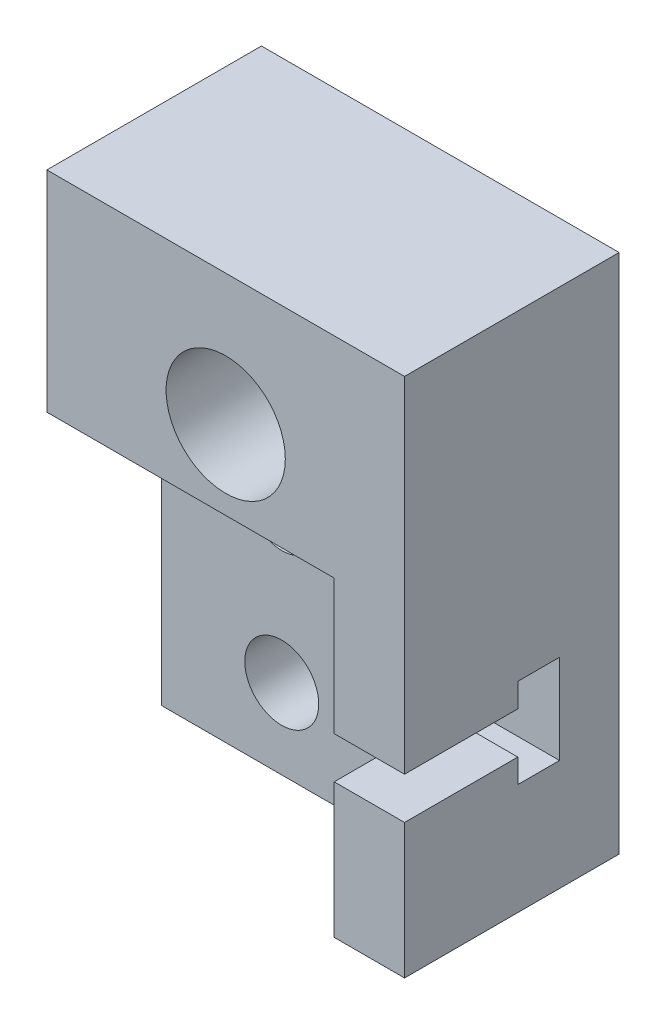
ISO-10303-21;
HEADER;
FILE_DESCRIPTION(('STEP AP214'),'2;1');
FILE_NAME('part.step','',(''),(''),'','','');
FILE_SCHEMA(('AUTOMOTIVE_DESIGN { 1 0 10303 214 1 1 1 1 }'));
ENDSEC;
DATA;
#1=APPLICATION_CONTEXT('core data for automotive mechanical design processes');
#2=APPLICATION_PROTOCOL_DEFINITION('international standard','automotive_design',2000,#1);
#3=PRODUCT_CONTEXT('',#1,'mechanical');
#4=PRODUCT('Part','Part','',(#3));
#5=PRODUCT_RELATED_PRODUCT_CATEGORY('part','',(#4));
#6=PRODUCT_DEFINITION_FORMATION('','',#4);
#7=PRODUCT_DEFINITION_CONTEXT('part definition',#1,'design');
#8=PRODUCT_DEFINITION('design','',#6,#7);
#9=PRODUCT_DEFINITION_SHAPE('','',#8);
#10=(LENGTH_UNIT() NAMED_UNIT(*) SI_UNIT(.MILLI.,.METRE.));
#11=(NAMED_UNIT(*) PLANE_ANGLE_UNIT() SI_UNIT($,.RADIAN.));
#12=(NAMED_UNIT(*) SI_UNIT($,.STERADIAN.) SOLID_ANGLE_UNIT());
#13=UNCERTAINTY_MEASURE_WITH_UNIT(LENGTH_MEASURE(1.E-05),#10,'distance_accuracy_value','');
#14=(GEOMETRIC_REPRESENTATION_CONTEXT(3) GLOBAL_UNCERTAINTY_ASSIGNED_CONTEXT((#13)) GLOBAL_UNIT_ASSIGNED_CONTEXT((#10,
#11,#12)) REPRESENTATION_CONTEXT('',''));
#15=CARTESIAN_POINT('',(0.,0.,0.));
#16=DIRECTION('',(0.,0.,1.));
#17=DIRECTION('',(1.,0.,0.));
#18=AXIS2_PLACEMENT_3D('',#15,#16,#17);
#19=CARTESIAN_POINT('',(12.05,13.05,4.2));
#20=DIRECTION('',(1.,0.,0.));
#21=DIRECTION('',(0.,1.,0.));
#22=AXIS2_PLACEMENT_3D('',#19,#20,#21);
#23=PLANE('',#22);
#24=DIRECTION('',(0.,1.,0.));
#25=VECTOR('',#24,1.);
#26=CARTESIAN_POINT('',(12.05,13.05,4.2));
#27=LINE('',#26,#25);
#28=CARTESIAN_POINT('',(12.05,8.4,4.2));
#29=VERTEX_POINT('',#28);
#30=CARTESIAN_POINT('',(12.05,13.05,4.2));
#31=VERTEX_POINT('',#30);
#32=EDGE_CURVE('E250',#29,#31,#27,.T.);
#33=ORIENTED_EDGE('',*,*,#32,.F.);
#34=DIRECTION('',(0.,0.,1.));
#35=VECTOR('',#34,1.);
#36=CARTESIAN_POINT('',(12.05,8.4,2.5));
#37=LINE('',#36,#35);
#38=CARTESIAN_POINT('',(12.05,8.4,4.25));
#39=VERTEX_POINT('',#38);
#40=EDGE_CURVE('E210',#29,#39,#37,.T.);
#41=ORIENTED_EDGE('',*,*,#40,.T.);
#42=DIRECTION('',(0.,-1.,0.));
#43=VECTOR('',#42,1.);
#44=CARTESIAN_POINT('',(12.05,8.4,4.25));
#45=LINE('',#44,#43);
#46=CARTESIAN_POINT('',(12.05,7.4,4.25));
#47=VERTEX_POINT('',#46);
#48=EDGE_CURVE('E198',#39,#47,#45,.T.);
#49=ORIENTED_EDGE('',*,*,#48,.T.);
#50=DIRECTION('',(0.,0.,1.));
#51=VECTOR('',#50,1.);
#52=CARTESIAN_POINT('',(12.05,7.4,4.25));
#53=LINE('',#52,#51);
#54=CARTESIAN_POINT('',(12.05,7.4,9.));
#55=VERTEX_POINT('',#54);
#56=EDGE_CURVE('E222',#47,#55,#53,.T.);
#57=ORIENTED_EDGE('',*,*,#56,.T.);
#58=DIRECTION('',(0.,1.,0.));
#59=VECTOR('',#58,1.);
#60=CARTESIAN_POINT('',(12.05,13.05,9.));
#61=LINE('',#60,#59);
#62=CARTESIAN_POINT('',(12.05,13.05,9.));
#63=VERTEX_POINT('',#62);
#64=EDGE_CURVE('E235',#55,#63,#61,.T.);
#65=ORIENTED_EDGE('',*,*,#64,.T.);
#66=DIRECTION('',(0.,0.,1.));
#67=VECTOR('',#66,1.);
#68=CARTESIAN_POINT('',(12.05,13.05,4.2));
#69=LINE('',#68,#67);
#70=EDGE_CURVE('E265',#31,#63,#69,.T.);
#71=ORIENTED_EDGE('',*,*,#70,.F.);
#72=EDGE_LOOP('',(#33,#41,#49,#57,#65,#71));
#73=FACE_BOUND('',#72,.T.);
#74=ADVANCED_FACE('F41',(#73),#23,.F.);
#75=CARTESIAN_POINT('',(0.,0.,9.));
#76=DIRECTION('',(0.,0.,-1.));
#77=DIRECTION('',(-1.,0.,0.));
#78=AXIS2_PLACEMENT_3D('',#75,#76,#77);
#79=PLANE('',#78);
#80=CARTESIAN_POINT('',(7.5,16.35,9.));
#81=DIRECTION('',(0.,0.,1.));
#82=DIRECTION('',(1.,0.,0.));
#83=AXIS2_PLACEMENT_3D('',#80,#81,#82);
#84=CIRCLE('',#83,2.5);
#85=CARTESIAN_POINT('',(10.,16.35,9.));
#86=VERTEX_POINT('',#85);
#87=EDGE_CURVE('E193',#86,#86,#84,.T.);
#88=ORIENTED_EDGE('',*,*,#87,.F.);
#89=EDGE_LOOP('',(#88));
#90=FACE_BOUND('',#89,.T.);
#91=ORIENTED_EDGE('',*,*,#64,.F.);
#92=DIRECTION('',(-1.,0.,0.));
#93=VECTOR('',#92,1.);
#94=CARTESIAN_POINT('',(12.05,7.4,9.));
#95=LINE('',#94,#93);
#96=CARTESIAN_POINT('',(15.,7.4,9.));
#97=VERTEX_POINT('',#96);
#98=EDGE_CURVE('E217',#97,#55,#95,.T.);
#99=ORIENTED_EDGE('',*,*,#98,.F.);
#100=DIRECTION('',(0.,1.,0.));
#101=VECTOR('',#100,1.);
#102=CARTESIAN_POINT('',(15.,0.,9.));
#103=LINE('',#102,#101);
#104=CARTESIAN_POINT('',(15.,21.85,9.));
#105=VERTEX_POINT('',#104);
#106=EDGE_CURVE('E275',#97,#105,#103,.T.);
#107=ORIENTED_EDGE('',*,*,#106,.T.);
#108=DIRECTION('',(-1.,0.,0.));
#109=VECTOR('',#108,1.);
#110=CARTESIAN_POINT('',(0.,21.85,9.));
#111=LINE('',#110,#109);
#112=CARTESIAN_POINT('',(0.,21.85,9.));
#113=VERTEX_POINT('',#112);
#114=EDGE_CURVE('E279',#105,#113,#111,.T.);
#115=ORIENTED_EDGE('',*,*,#114,.T.);
#116=DIRECTION('',(0.,-1.,0.));
#117=VECTOR('',#116,1.);
#118=CARTESIAN_POINT('',(0.,0.,9.));
#119=LINE('',#118,#117);
#120=CARTESIAN_POINT('',(0.,13.05,9.));
#121=VERTEX_POINT('',#120);
#122=EDGE_CURVE('E269',#113,#121,#119,.T.);
#123=ORIENTED_EDGE('',*,*,#122,.T.);
#124=DIRECTION('',(-1.,0.,0.));
#125=VECTOR('',#124,1.);
#126=CARTESIAN_POINT('',(0.,13.05,9.));
#127=LINE('',#126,#125);
#128=EDGE_CURVE('E247',#63,#121,#127,.T.);
#129=ORIENTED_EDGE('',*,*,#128,.F.);
#130=EDGE_LOOP('',(#91,#99,#107,#115,#123,#129));
#131=FACE_BOUND('',#130,.T.);
#132=ADVANCED_FACE('F329',(#90,#131),#79,.F.);
#133=CARTESIAN_POINT('',(0.,0.,9.));
#134=DIRECTION('',(1.,0.,0.));
#135=DIRECTION('',(0.,0.,-1.));
#136=AXIS2_PLACEMENT_3D('',#133,#134,#135);
#137=PLANE('',#136);
#138=DIRECTION('',(0.,-1.,0.));
#139=VECTOR('',#138,1.);
#140=CARTESIAN_POINT('',(0.,13.05,4.2));
#141=LINE('',#140,#139);
#142=CARTESIAN_POINT('',(0.,13.05,4.2));
#143=VERTEX_POINT('',#142);
#144=CARTESIAN_POINT('',(0.,0.,4.2));
#145=VERTEX_POINT('',#144);
#146=EDGE_CURVE('E244',#143,#145,#141,.T.);
#147=ORIENTED_EDGE('',*,*,#146,.F.);
#148=DIRECTION('',(0.,0.,1.));
#149=VECTOR('',#148,1.);
#150=CARTESIAN_POINT('',(0.,13.05,4.2));
#151=LINE('',#150,#149);
#152=EDGE_CURVE('E261',#143,#121,#151,.T.);
#153=ORIENTED_EDGE('',*,*,#152,.T.);
#154=ORIENTED_EDGE('',*,*,#122,.F.);
#155=DIRECTION('',(0.,0.,-1.));
#156=VECTOR('',#155,1.);
#157=CARTESIAN_POINT('',(0.,21.85,9.));
#158=LINE('',#157,#156);
#159=CARTESIAN_POINT('',(0.,21.85,0.));
#160=VERTEX_POINT('',#159);
#161=EDGE_CURVE('E281',#113,#160,#158,.T.);
#162=ORIENTED_EDGE('',*,*,#161,.T.);
#163=DIRECTION('',(0.,-1.,0.));
#164=VECTOR('',#163,1.);
#165=CARTESIAN_POINT('',(0.,0.,0.));
#166=LINE('',#165,#164);
#167=CARTESIAN_POINT('',(0.,0.,0.));
#168=VERTEX_POINT('',#167);
#169=EDGE_CURVE('E264',#160,#168,#166,.T.);
#170=ORIENTED_EDGE('',*,*,#169,.T.);
#171=DIRECTION('',(0.,0.,-1.));
#172=VECTOR('',#171,1.);
#173=CARTESIAN_POINT('',(0.,0.,9.));
#174=LINE('',#173,#172);
#175=EDGE_CURVE('E297',#145,#168,#174,.T.);
#176=ORIENTED_EDGE('',*,*,#175,.F.);
#177=EDGE_LOOP('',(#147,#153,#154,#162,#170,#176));
#178=FACE_BOUND('',#177,.T.);
#179=ADVANCED_FACE('F326',(#178),#137,.F.);
#180=CARTESIAN_POINT('',(0.,0.,9.));
#181=DIRECTION('',(0.,1.,0.));
#182=DIRECTION('',(0.,0.,1.));
#183=AXIS2_PLACEMENT_3D('',#180,#181,#182);
#184=PLANE('',#183);
#185=DIRECTION('',(1.,0.,0.));
#186=VECTOR('',#185,1.);
#187=CARTESIAN_POINT('',(0.,0.,9.));
#188=LINE('',#187,#186);
#189=CARTESIAN_POINT('',(12.05,0.,9.));
#190=VERTEX_POINT('',#189);
#191=CARTESIAN_POINT('',(15.,0.,9.));
#192=VERTEX_POINT('',#191);
#193=EDGE_CURVE('E272',#190,#192,#188,.T.);
#194=ORIENTED_EDGE('',*,*,#193,.F.);
#195=DIRECTION('',(0.,0.,1.));
#196=VECTOR('',#195,1.);
#197=CARTESIAN_POINT('',(12.05,0.,4.2));
#198=LINE('',#197,#196);
#199=CARTESIAN_POINT('',(12.05,0.,4.2));
#200=VERTEX_POINT('',#199);
#201=EDGE_CURVE('E256',#200,#190,#198,.T.);
#202=ORIENTED_EDGE('',*,*,#201,.F.);
#203=DIRECTION('',(1.,0.,0.));
#204=VECTOR('',#203,1.);
#205=CARTESIAN_POINT('',(0.,0.,4.2));
#206=LINE('',#205,#204);
#207=EDGE_CURVE('E246',#145,#200,#206,.T.);
#208=ORIENTED_EDGE('',*,*,#207,.F.);
#209=ORIENTED_EDGE('',*,*,#175,.T.);
#210=DIRECTION('',(1.,0.,0.));
#211=VECTOR('',#210,1.);
#212=CARTESIAN_POINT('',(0.,0.,0.));
#213=LINE('',#212,#211);
#214=CARTESIAN_POINT('',(15.,0.,0.));
#215=VERTEX_POINT('',#214);
#216=EDGE_CURVE('E284',#168,#215,#213,.T.);
#217=ORIENTED_EDGE('',*,*,#216,.T.);
#218=DIRECTION('',(0.,0.,-1.));
#219=VECTOR('',#218,1.);
#220=CARTESIAN_POINT('',(15.,0.,9.));
#221=LINE('',#220,#219);
#222=EDGE_CURVE('E294',#192,#215,#221,.T.);
#223=ORIENTED_EDGE('',*,*,#222,.F.);
#224=EDGE_LOOP('',(#194,#202,#208,#209,#217,#223));
#225=FACE_BOUND('',#224,.T.);
#226=ADVANCED_FACE('F346',(#225),#184,.F.);
#227=CARTESIAN_POINT('',(15.,0.,9.));
#228=DIRECTION('',(-1.,0.,0.));
#229=DIRECTION('',(0.,0.,1.));
#230=AXIS2_PLACEMENT_3D('',#227,#228,#229);
#231=PLANE('',#230);
#232=DIRECTION('',(0.,0.,1.));
#233=VECTOR('',#232,1.);
#234=CARTESIAN_POINT('',(15.,4.65,2.5));
#235=LINE('',#234,#233);
#236=CARTESIAN_POINT('',(15.,4.65,2.5));
#237=VERTEX_POINT('',#236);
#238=CARTESIAN_POINT('',(15.,4.65,4.25));
#239=VERTEX_POINT('',#238);
#240=EDGE_CURVE('E172',#237,#239,#235,.T.);
#241=ORIENTED_EDGE('',*,*,#240,.T.);
#242=DIRECTION('',(0.,1.,0.));
#243=VECTOR('',#242,1.);
#244=CARTESIAN_POINT('',(15.,8.4,4.25));
#245=LINE('',#244,#243);
#246=CARTESIAN_POINT('',(15.,5.65,4.25));
#247=VERTEX_POINT('',#246);
#248=EDGE_CURVE('E190',#239,#247,#245,.T.);
#249=ORIENTED_EDGE('',*,*,#248,.T.);
#250=DIRECTION('',(0.,0.,1.));
#251=VECTOR('',#250,1.);
#252=CARTESIAN_POINT('',(15.,5.65,4.25));
#253=LINE('',#252,#251);
#254=CARTESIAN_POINT('',(15.,5.65,9.));
#255=VERTEX_POINT('',#254);
#256=EDGE_CURVE('E228',#247,#255,#253,.T.);
#257=ORIENTED_EDGE('',*,*,#256,.T.);
#258=EDGE_CURVE('E276',#192,#255,#103,.T.);
#259=ORIENTED_EDGE('',*,*,#258,.F.);
#260=ORIENTED_EDGE('',*,*,#222,.T.);
#261=DIRECTION('',(0.,1.,0.));
#262=VECTOR('',#261,1.);
#263=CARTESIAN_POINT('',(15.,0.,0.));
#264=LINE('',#263,#262);
#265=CARTESIAN_POINT('',(15.,21.85,0.));
#266=VERTEX_POINT('',#265);
#267=EDGE_CURVE('E286',#215,#266,#264,.T.);
#268=ORIENTED_EDGE('',*,*,#267,.T.);
#269=DIRECTION('',(0.,0.,-1.));
#270=VECTOR('',#269,1.);
#271=CARTESIAN_POINT('',(15.,21.85,9.));
#272=LINE('',#271,#270);
#273=EDGE_CURVE('E291',#105,#266,#272,.T.);
#274=ORIENTED_EDGE('',*,*,#273,.F.);
#275=ORIENTED_EDGE('',*,*,#106,.F.);
#276=DIRECTION('',(0.,0.,1.));
#277=VECTOR('',#276,1.);
#278=CARTESIAN_POINT('',(15.,7.4,4.25));
#279=LINE('',#278,#277);
#280=CARTESIAN_POINT('',(15.,7.4,4.25));
#281=VERTEX_POINT('',#280);
#282=EDGE_CURVE('E226',#281,#97,#279,.T.);
#283=ORIENTED_EDGE('',*,*,#282,.F.);
#284=CARTESIAN_POINT('',(15.,8.4,4.25));
#285=VERTEX_POINT('',#284);
#286=EDGE_CURVE('E204',#281,#285,#245,.T.);
#287=ORIENTED_EDGE('',*,*,#286,.T.);
#288=DIRECTION('',(0.,0.,1.));
#289=VECTOR('',#288,1.);
#290=CARTESIAN_POINT('',(15.,8.4,2.5));
#291=LINE('',#290,#289);
#292=CARTESIAN_POINT('',(15.,8.4,2.5));
#293=VERTEX_POINT('',#292);
#294=EDGE_CURVE('E211',#293,#285,#291,.T.);
#295=ORIENTED_EDGE('',*,*,#294,.F.);
#296=DIRECTION('',(0.,1.,0.));
#297=VECTOR('',#296,1.);
#298=CARTESIAN_POINT('',(15.,8.4,2.5));
#299=LINE('',#298,#297);
#300=EDGE_CURVE('E182',#237,#293,#299,.T.);
#301=ORIENTED_EDGE('',*,*,#300,.F.);
#302=EDGE_LOOP('',(#241,#249,#257,#259,#260,#268,#274,#275,#283,#287,#295,#301));
#303=FACE_BOUND('',#302,.T.);
#304=ADVANCED_FACE('F350',(#303),#231,.F.);
#305=CARTESIAN_POINT('',(0.,21.85,9.));
#306=DIRECTION('',(0.,-1.,0.));
#307=DIRECTION('',(0.,0.,-1.));
#308=AXIS2_PLACEMENT_3D('',#305,#306,#307);
#309=PLANE('',#308);
#310=DIRECTION('',(-1.,0.,0.));
#311=VECTOR('',#310,1.);
#312=CARTESIAN_POINT('',(0.,21.85,0.));
#313=LINE('',#312,#311);
#314=EDGE_CURVE('E273',#266,#160,#313,.T.);
#315=ORIENTED_EDGE('',*,*,#314,.T.);
#316=ORIENTED_EDGE('',*,*,#161,.F.);
#317=ORIENTED_EDGE('',*,*,#114,.F.);
#318=ORIENTED_EDGE('',*,*,#273,.T.);
#319=EDGE_LOOP('',(#315,#316,#317,#318));
#320=FACE_BOUND('',#319,.T.);
#321=ADVANCED_FACE('F336',(#320),#309,.F.);
#322=ORIENTED_EDGE('',*,*,#258,.T.);
#323=DIRECTION('',(1.,0.,0.));
#324=VECTOR('',#323,1.);
#325=CARTESIAN_POINT('',(12.05,5.65,9.));
#326=LINE('',#325,#324);
#327=CARTESIAN_POINT('',(12.05,5.65,9.));
#328=VERTEX_POINT('',#327);
#329=EDGE_CURVE('E209',#328,#255,#326,.T.);
#330=ORIENTED_EDGE('',*,*,#329,.F.);
#331=EDGE_CURVE('E257',#190,#328,#61,.T.);
#332=ORIENTED_EDGE('',*,*,#331,.F.);
#333=ORIENTED_EDGE('',*,*,#193,.T.);
#334=EDGE_LOOP('',(#322,#330,#332,#333));
#335=FACE_BOUND('',#334,.T.);
#336=ADVANCED_FACE('F354',(#335),#79,.F.);
#337=CARTESIAN_POINT('',(0.,0.,0.));
#338=DIRECTION('',(0.,0.,-1.));
#339=DIRECTION('',(-1.,0.,0.));
#340=AXIS2_PLACEMENT_3D('',#337,#338,#339);
#341=PLANE('',#340);
#342=CARTESIAN_POINT('',(7.5,16.35,0.));
#343=DIRECTION('',(0.,0.,1.));
#344=DIRECTION('',(1.,0.,0.));
#345=AXIS2_PLACEMENT_3D('',#342,#343,#344);
#346=CIRCLE('',#345,2.5);
#347=CARTESIAN_POINT('',(10.,16.35,0.));
#348=VERTEX_POINT('',#347);
#349=EDGE_CURVE('E557',#348,#348,#346,.T.);
#350=ORIENTED_EDGE('',*,*,#349,.T.);
#351=EDGE_LOOP('',(#350));
#352=FACE_BOUND('',#351,.T.);
#353=ORIENTED_EDGE('',*,*,#169,.F.);
#354=ORIENTED_EDGE('',*,*,#314,.F.);
#355=ORIENTED_EDGE('',*,*,#267,.F.);
#356=ORIENTED_EDGE('',*,*,#216,.F.);
#357=EDGE_LOOP('',(#353,#354,#355,#356));
#358=FACE_BOUND('',#357,.T.);
#359=ADVANCED_FACE('F341',(#352,#358),#341,.T.);
#360=CARTESIAN_POINT('',(0.,13.05,4.2));
#361=DIRECTION('',(0.,1.,0.));
#362=DIRECTION('',(0.,0.,1.));
#363=AXIS2_PLACEMENT_3D('',#360,#361,#362);
#364=PLANE('',#363);
#365=ORIENTED_EDGE('',*,*,#128,.T.);
#366=ORIENTED_EDGE('',*,*,#152,.F.);
#367=DIRECTION('',(-1.,0.,0.));
#368=VECTOR('',#367,1.);
#369=CARTESIAN_POINT('',(0.,13.05,4.2));
#370=LINE('',#369,#368);
#371=EDGE_CURVE('E253',#31,#143,#370,.T.);
#372=ORIENTED_EDGE('',*,*,#371,.F.);
#373=ORIENTED_EDGE('',*,*,#70,.T.);
#374=EDGE_LOOP('',(#365,#366,#372,#373));
#375=FACE_BOUND('',#374,.T.);
#376=ADVANCED_FACE('F323',(#375),#364,.F.);
#377=CARTESIAN_POINT('',(12.05,5.65,4.25));
#378=VERTEX_POINT('',#377);
#379=CARTESIAN_POINT('',(12.05,4.65,4.25));
#380=VERTEX_POINT('',#379);
#381=EDGE_CURVE('E202',#378,#380,#45,.T.);
#382=ORIENTED_EDGE('',*,*,#381,.T.);
#383=DIRECTION('',(0.,0.,1.));
#384=VECTOR('',#383,1.);
#385=CARTESIAN_POINT('',(12.05,4.65,2.5));
#386=LINE('',#385,#384);
#387=CARTESIAN_POINT('',(12.05,4.65,4.2));
#388=VERTEX_POINT('',#387);
#389=EDGE_CURVE('E173',#388,#380,#386,.T.);
#390=ORIENTED_EDGE('',*,*,#389,.F.);
#391=EDGE_CURVE('E251',#200,#388,#27,.T.);
#392=ORIENTED_EDGE('',*,*,#391,.F.);
#393=ORIENTED_EDGE('',*,*,#201,.T.);
#394=ORIENTED_EDGE('',*,*,#331,.T.);
#395=DIRECTION('',(0.,0.,1.));
#396=VECTOR('',#395,1.);
#397=CARTESIAN_POINT('',(12.05,5.65,4.25));
#398=LINE('',#397,#396);
#399=EDGE_CURVE('E219',#378,#328,#398,.T.);
#400=ORIENTED_EDGE('',*,*,#399,.F.);
#401=EDGE_LOOP('',(#382,#390,#392,#393,#394,#400));
#402=FACE_BOUND('',#401,.T.);
#403=ADVANCED_FACE('F359',(#402),#23,.F.);
#404=CARTESIAN_POINT('',(0.,0.,4.2));
#405=DIRECTION('',(0.,0.,1.));
#406=DIRECTION('',(1.,0.,0.));
#407=AXIS2_PLACEMENT_3D('',#404,#405,#406);
#408=PLANE('',#407);
#409=CARTESIAN_POINT('',(5.05,9.7,4.2));
#410=DIRECTION('',(0.,0.,1.));
#411=DIRECTION('',(1.,0.,0.));
#412=AXIS2_PLACEMENT_3D('',#409,#410,#411);
#413=CIRCLE('',#412,1.55);
#414=CARTESIAN_POINT('',(6.6,9.7,4.2));
#415=VERTEX_POINT('',#414);
#416=EDGE_CURVE('E236',#415,#415,#413,.T.);
#417=ORIENTED_EDGE('',*,*,#416,.F.);
#418=EDGE_LOOP('',(#417));
#419=FACE_BOUND('',#418,.T.);
#420=CARTESIAN_POINT('',(5.05,3.35,4.2));
#421=DIRECTION('',(0.,0.,1.));
#422=DIRECTION('',(1.,0.,0.));
#423=AXIS2_PLACEMENT_3D('',#420,#421,#422);
#424=CIRCLE('',#423,1.55);
#425=CARTESIAN_POINT('',(6.6,3.35,4.2));
#426=VERTEX_POINT('',#425);
#427=EDGE_CURVE('E239',#426,#426,#424,.T.);
#428=ORIENTED_EDGE('',*,*,#427,.F.);
#429=EDGE_LOOP('',(#428));
#430=FACE_BOUND('',#429,.T.);
#431=ORIENTED_EDGE('',*,*,#391,.T.);
#432=DIRECTION('',(-1.,0.,0.));
#433=VECTOR('',#432,1.);
#434=CARTESIAN_POINT('',(12.05,4.65,4.2));
#435=LINE('',#434,#433);
#436=CARTESIAN_POINT('',(11.05,4.65000000000001,4.2));
#437=VERTEX_POINT('',#436);
#438=EDGE_CURVE('E57',#388,#437,#435,.T.);
#439=ORIENTED_EDGE('',*,*,#438,.T.);
#440=DIRECTION('',(0.,1.,0.));
#441=VECTOR('',#440,1.);
#442=CARTESIAN_POINT('',(11.05,8.4,4.2));
#443=LINE('',#442,#441);
#444=CARTESIAN_POINT('',(11.05,8.4,4.2));
#445=VERTEX_POINT('',#444);
#446=EDGE_CURVE('E302',#437,#445,#443,.T.);
#447=ORIENTED_EDGE('',*,*,#446,.T.);
#448=DIRECTION('',(1.,0.,0.));
#449=VECTOR('',#448,1.);
#450=CARTESIAN_POINT('',(12.05,8.4,4.2));
#451=LINE('',#450,#449);
#452=EDGE_CURVE('E300',#445,#29,#451,.T.);
#453=ORIENTED_EDGE('',*,*,#452,.T.);
#454=ORIENTED_EDGE('',*,*,#32,.T.);
#455=ORIENTED_EDGE('',*,*,#371,.T.);
#456=ORIENTED_EDGE('',*,*,#146,.T.);
#457=ORIENTED_EDGE('',*,*,#207,.T.);
#458=EDGE_LOOP('',(#431,#439,#447,#453,#454,#455,#456,#457));
#459=FACE_BOUND('',#458,.T.);
#460=ADVANCED_FACE('F307',(#419,#430,#459),#408,.T.);
#461=CARTESIAN_POINT('',(5.05,3.35,1.1));
#462=DIRECTION('',(0.,0.,1.));
#463=DIRECTION('',(1.,0.,0.));
#464=AXIS2_PLACEMENT_3D('',#461,#462,#463);
#465=CYLINDRICAL_SURFACE('',#464,1.55);
#466=CARTESIAN_POINT('',(5.05,3.35,1.1));
#467=DIRECTION('',(0.,0.,1.));
#468=DIRECTION('',(1.,0.,0.));
#469=AXIS2_PLACEMENT_3D('',#466,#467,#468);
#470=CIRCLE('',#469,1.55);
#471=CARTESIAN_POINT('',(6.6,3.35,1.1));
#472=VERTEX_POINT('',#471);
#473=EDGE_CURVE('E225',#472,#472,#470,.T.);
#474=CARTESIAN_POINT('',(6.6,3.35,1.1));
#475=CARTESIAN_POINT('',(6.6,3.35,1.13229166666667));
#476=CARTESIAN_POINT('',(6.6,3.35,1.16458333333333));
#477=CARTESIAN_POINT('',(6.6,3.35,1.22916666666667));
#478=CARTESIAN_POINT('',(6.6,3.35,1.26145833333333));
#479=CARTESIAN_POINT('',(6.6,3.35,1.32604166666667));
#480=CARTESIAN_POINT('',(6.6,3.35,1.35833333333333));
#481=CARTESIAN_POINT('',(6.6,3.35,1.42291666666667));
#482=CARTESIAN_POINT('',(6.6,3.35,1.45520833333333));
#483=CARTESIAN_POINT('',(6.6,3.35,1.51979166666667));
#484=CARTESIAN_POINT('',(6.6,3.35,1.55208333333333));
#485=CARTESIAN_POINT('',(6.6,3.35,1.61666666666667));
#486=CARTESIAN_POINT('',(6.6,3.35,1.64895833333333));
#487=CARTESIAN_POINT('',(6.6,3.35,1.71354166666667));
#488=CARTESIAN_POINT('',(6.6,3.35,1.74583333333333));
#489=CARTESIAN_POINT('',(6.6,3.35,1.81041666666667));
#490=CARTESIAN_POINT('',(6.6,3.35,1.84270833333333));
#491=CARTESIAN_POINT('',(6.6,3.35,1.90729166666667));
#492=CARTESIAN_POINT('',(6.6,3.35,1.93958333333333));
#493=CARTESIAN_POINT('',(6.6,3.35,2.00416666666667));
#494=CARTESIAN_POINT('',(6.6,3.35,2.03645833333333));
#495=CARTESIAN_POINT('',(6.6,3.35,2.10104166666667));
#496=CARTESIAN_POINT('',(6.6,3.35,2.13333333333333));
#497=CARTESIAN_POINT('',(6.6,3.35,2.19791666666667));
#498=CARTESIAN_POINT('',(6.6,3.35,2.23020833333333));
#499=CARTESIAN_POINT('',(6.6,3.35,2.29479166666667));
#500=CARTESIAN_POINT('',(6.6,3.35,2.32708333333333));
#501=CARTESIAN_POINT('',(6.6,3.35,2.39166666666667));
#502=CARTESIAN_POINT('',(6.6,3.35,2.42395833333333));
#503=CARTESIAN_POINT('',(6.6,3.35,2.48854166666667));
#504=CARTESIAN_POINT('',(6.6,3.35,2.52083333333333));
#505=CARTESIAN_POINT('',(6.6,3.35,2.58541666666667));
#506=CARTESIAN_POINT('',(6.6,3.35,2.61770833333333));
#507=CARTESIAN_POINT('',(6.6,3.35,2.68229166666667));
#508=CARTESIAN_POINT('',(6.6,3.35,2.71458333333333));
#509=CARTESIAN_POINT('',(6.6,3.35,2.77916666666667));
#510=CARTESIAN_POINT('',(6.6,3.35,2.81145833333333));
#511=CARTESIAN_POINT('',(6.6,3.35,2.87604166666667));
#512=CARTESIAN_POINT('',(6.6,3.35,2.90833333333333));
#513=CARTESIAN_POINT('',(6.6,3.35,2.97291666666667));
#514=CARTESIAN_POINT('',(6.6,3.35,3.00520833333333));
#515=CARTESIAN_POINT('',(6.6,3.35,3.06979166666667));
#516=CARTESIAN_POINT('',(6.6,3.35,3.10208333333333));
#517=CARTESIAN_POINT('',(6.6,3.35,3.16666666666667));
#518=CARTESIAN_POINT('',(6.6,3.35,3.19895833333333));
#519=CARTESIAN_POINT('',(6.6,3.35,3.26354166666667));
#520=CARTESIAN_POINT('',(6.6,3.35,3.29583333333333));
#521=CARTESIAN_POINT('',(6.6,3.35,3.36041666666667));
#522=CARTESIAN_POINT('',(6.6,3.35,3.39270833333333));
#523=CARTESIAN_POINT('',(6.6,3.35,3.45729166666667));
#524=CARTESIAN_POINT('',(6.6,3.35,3.48958333333333));
#525=CARTESIAN_POINT('',(6.6,3.35,3.55416666666667));
#526=CARTESIAN_POINT('',(6.6,3.35,3.58645833333333));
#527=CARTESIAN_POINT('',(6.6,3.35,3.65104166666667));
#528=CARTESIAN_POINT('',(6.6,3.35,3.68333333333333));
#529=CARTESIAN_POINT('',(6.6,3.35,3.74791666666667));
#530=CARTESIAN_POINT('',(6.6,3.35,3.78020833333333));
#531=CARTESIAN_POINT('',(6.6,3.35,3.84479166666667));
#532=CARTESIAN_POINT('',(6.6,3.35,3.87708333333333));
#533=CARTESIAN_POINT('',(6.6,3.35,3.94166666666667));
#534=CARTESIAN_POINT('',(6.6,3.35,3.97395833333333));
#535=CARTESIAN_POINT('',(6.6,3.35,4.03854166666667));
#536=CARTESIAN_POINT('',(6.6,3.35,4.07083333333333));
#537=CARTESIAN_POINT('',(6.6,3.35,4.13541666666667));
#538=CARTESIAN_POINT('',(6.6,3.35,4.16770833333333));
#539=CARTESIAN_POINT('',(6.6,3.35,4.2));
#540=B_SPLINE_CURVE_WITH_KNOTS('',3,(#474,#475,#476,#477,#478,#479,#480,#481,#482,#483,#484,
#485,#486,#487,#488,#489,#490,#491,#492,#493,#494,#495,#496,#497,#498,#499,#500,#501,#502,#503,
#504,#505,#506,#507,#508,#509,#510,#511,#512,#513,#514,#515,#516,#517,#518,#519,#520,#521,#522,
#523,#524,#525,#526,#527,#528,#529,#530,#531,#532,#533,#534,#535,#536,#537,#538,#539),
.UNSPECIFIED.,.F.,.F.,(4,2,2,2,2,2,2,2,2,2,2,2,2,2,2,2,2,2,2,2,2,2,2,2,2,2,2,2,2,2,2,2,4),(0.,
0.0968750000000002,0.19375,0.290625,0.3875,0.484375,0.58125,0.678125,0.775,0.871875,0.96875,
1.065625,1.1625,1.259375,1.35625,1.453125,1.55,1.646875,1.74375,1.840625,1.9375,2.034375,
2.13125,2.228125,2.325,2.421875,2.51875,2.615625,2.7125,2.809375,2.90625,3.003125,3.1),.UNSPECIFIED.);
#541=EDGE_CURVE('BSEAM395',#472,#426,#540,.T.);
#542=ORIENTED_EDGE('',*,*,#473,.F.);
#543=ORIENTED_EDGE('',*,*,#427,.T.);
#544=ORIENTED_EDGE('',*,*,#541,.T.);
#545=ORIENTED_EDGE('',*,*,#541,.F.);
#546=EDGE_LOOP('',(#542,#544,#543,#545));
#547=FACE_BOUND('',#546,.T.);
#548=ADVANCED_FACE('F395',(#547),#465,.F.);
#549=CARTESIAN_POINT('',(5.05,3.35,1.1));
#550=DIRECTION('',(0.,0.,1.));
#551=DIRECTION('',(1.,0.,0.));
#552=AXIS2_PLACEMENT_3D('',#549,#550,#551);
#553=PLANE('',#552);
#554=ORIENTED_EDGE('',*,*,#473,.T.);
#555=EDGE_LOOP('',(#554));
#556=FACE_BOUND('',#555,.T.);
#557=ADVANCED_FACE('F407',(#556),#553,.T.);
#558=CARTESIAN_POINT('',(5.05,9.7,1.1));
#559=DIRECTION('',(0.,0.,1.));
#560=DIRECTION('',(1.,0.,0.));
#561=AXIS2_PLACEMENT_3D('',#558,#559,#560);
#562=CYLINDRICAL_SURFACE('',#561,1.55);
#563=CARTESIAN_POINT('',(5.05,9.7,1.1));
#564=DIRECTION('',(0.,0.,1.));
#565=DIRECTION('',(1.,0.,0.));
#566=AXIS2_PLACEMENT_3D('',#563,#564,#565);
#567=CIRCLE('',#566,1.55);
#568=CARTESIAN_POINT('',(6.6,9.7,1.1));
#569=VERTEX_POINT('',#568);
#570=EDGE_CURVE('E232',#569,#569,#567,.T.);
#571=CARTESIAN_POINT('',(6.6,9.7,1.1));
#572=CARTESIAN_POINT('',(6.6,9.7,1.13229166666667));
#573=CARTESIAN_POINT('',(6.6,9.7,1.16458333333333));
#574=CARTESIAN_POINT('',(6.6,9.7,1.22916666666667));
#575=CARTESIAN_POINT('',(6.6,9.7,1.26145833333333));
#576=CARTESIAN_POINT('',(6.6,9.7,1.32604166666667));
#577=CARTESIAN_POINT('',(6.6,9.7,1.35833333333333));
#578=CARTESIAN_POINT('',(6.6,9.7,1.42291666666667));
#579=CARTESIAN_POINT('',(6.6,9.7,1.45520833333333));
#580=CARTESIAN_POINT('',(6.6,9.7,1.51979166666667));
#581=CARTESIAN_POINT('',(6.6,9.7,1.55208333333333));
#582=CARTESIAN_POINT('',(6.6,9.7,1.61666666666667));
#583=CARTESIAN_POINT('',(6.6,9.7,1.64895833333333));
#584=CARTESIAN_POINT('',(6.6,9.7,1.71354166666667));
#585=CARTESIAN_POINT('',(6.6,9.7,1.74583333333333));
#586=CARTESIAN_POINT('',(6.6,9.7,1.81041666666667));
#587=CARTESIAN_POINT('',(6.6,9.7,1.84270833333333));
#588=CARTESIAN_POINT('',(6.6,9.7,1.90729166666667));
#589=CARTESIAN_POINT('',(6.6,9.7,1.93958333333333));
#590=CARTESIAN_POINT('',(6.6,9.7,2.00416666666667));
#591=CARTESIAN_POINT('',(6.6,9.7,2.03645833333333));
#592=CARTESIAN_POINT('',(6.6,9.7,2.10104166666667));
#593=CARTESIAN_POINT('',(6.6,9.7,2.13333333333333));
#594=CARTESIAN_POINT('',(6.6,9.7,2.19791666666667));
#595=CARTESIAN_POINT('',(6.6,9.7,2.23020833333333));
#596=CARTESIAN_POINT('',(6.6,9.7,2.29479166666667));
#597=CARTESIAN_POINT('',(6.6,9.7,2.32708333333333));
#598=CARTESIAN_POINT('',(6.6,9.7,2.39166666666667));
#599=CARTESIAN_POINT('',(6.6,9.7,2.42395833333333));
#600=CARTESIAN_POINT('',(6.6,9.7,2.48854166666667));
#601=CARTESIAN_POINT('',(6.6,9.7,2.52083333333333));
#602=CARTESIAN_POINT('',(6.6,9.7,2.58541666666667));
#603=CARTESIAN_POINT('',(6.6,9.7,2.61770833333333));
#604=CARTESIAN_POINT('',(6.6,9.7,2.68229166666667));
#605=CARTESIAN_POINT('',(6.6,9.7,2.71458333333333));
#606=CARTESIAN_POINT('',(6.6,9.7,2.77916666666667));
#607=CARTESIAN_POINT('',(6.6,9.7,2.81145833333333));
#608=CARTESIAN_POINT('',(6.6,9.7,2.87604166666667));
#609=CARTESIAN_POINT('',(6.6,9.7,2.90833333333333));
#610=CARTESIAN_POINT('',(6.6,9.7,2.97291666666667));
#611=CARTESIAN_POINT('',(6.6,9.7,3.00520833333333));
#612=CARTESIAN_POINT('',(6.6,9.7,3.06979166666667));
#613=CARTESIAN_POINT('',(6.6,9.7,3.10208333333333));
#614=CARTESIAN_POINT('',(6.6,9.7,3.16666666666667));
#615=CARTESIAN_POINT('',(6.6,9.7,3.19895833333333));
#616=CARTESIAN_POINT('',(6.6,9.7,3.26354166666667));
#617=CARTESIAN_POINT('',(6.6,9.7,3.29583333333333));
#618=CARTESIAN_POINT('',(6.6,9.7,3.36041666666667));
#619=CARTESIAN_POINT('',(6.6,9.7,3.39270833333333));
#620=CARTESIAN_POINT('',(6.6,9.7,3.45729166666667));
#621=CARTESIAN_POINT('',(6.6,9.7,3.48958333333333));
#622=CARTESIAN_POINT('',(6.6,9.7,3.55416666666667));
#623=CARTESIAN_POINT('',(6.6,9.7,3.58645833333333));
#624=CARTESIAN_POINT('',(6.6,9.7,3.65104166666667));
#625=CARTESIAN_POINT('',(6.6,9.7,3.68333333333333));
#626=CARTESIAN_POINT('',(6.6,9.7,3.74791666666667));
#627=CARTESIAN_POINT('',(6.6,9.7,3.78020833333333));
#628=CARTESIAN_POINT('',(6.6,9.7,3.84479166666667));
#629=CARTESIAN_POINT('',(6.6,9.7,3.87708333333333));
#630=CARTESIAN_POINT('',(6.6,9.7,3.94166666666667));
#631=CARTESIAN_POINT('',(6.6,9.7,3.97395833333333));
#632=CARTESIAN_POINT('',(6.6,9.7,4.03854166666667));
#633=CARTESIAN_POINT('',(6.6,9.7,4.07083333333333));
#634=CARTESIAN_POINT('',(6.6,9.7,4.13541666666667));
#635=CARTESIAN_POINT('',(6.6,9.7,4.16770833333333));
#636=CARTESIAN_POINT('',(6.6,9.7,4.2));
#637=B_SPLINE_CURVE_WITH_KNOTS('',3,(#571,#572,#573,#574,#575,#576,#577,#578,#579,#580,#581,
#582,#583,#584,#585,#586,#587,#588,#589,#590,#591,#592,#593,#594,#595,#596,#597,#598,#599,#600,
#601,#602,#603,#604,#605,#606,#607,#608,#609,#610,#611,#612,#613,#614,#615,#616,#617,#618,#619,
#620,#621,#622,#623,#624,#625,#626,#627,#628,#629,#630,#631,#632,#633,#634,#635,#636),
.UNSPECIFIED.,.F.,.F.,(4,2,2,2,2,2,2,2,2,2,2,2,2,2,2,2,2,2,2,2,2,2,2,2,2,2,2,2,2,2,2,2,4),(0.,
0.0968750000000002,0.19375,0.290625,0.3875,0.484375,0.58125,0.678125,0.775,0.871875,0.96875,
1.065625,1.1625,1.259375,1.35625,1.453125,1.55,1.646875,1.74375,1.840625,1.9375,2.034375,
2.13125,2.228125,2.325,2.421875,2.51875,2.615625,2.7125,2.809375,2.90625,3.003125,3.1),.UNSPECIFIED.);
#638=EDGE_CURVE('BSEAM410',#569,#415,#637,.T.);
#639=ORIENTED_EDGE('',*,*,#570,.F.);
#640=ORIENTED_EDGE('',*,*,#416,.T.);
#641=ORIENTED_EDGE('',*,*,#638,.T.);
#642=ORIENTED_EDGE('',*,*,#638,.F.);
#643=EDGE_LOOP('',(#639,#641,#640,#642));
#644=FACE_BOUND('',#643,.T.);
#645=ADVANCED_FACE('F410',(#644),#562,.F.);
#646=CARTESIAN_POINT('',(5.05,9.7,1.1));
#647=DIRECTION('',(0.,0.,1.));
#648=DIRECTION('',(1.,0.,0.));
#649=AXIS2_PLACEMENT_3D('',#646,#647,#648);
#650=PLANE('',#649);
#651=ORIENTED_EDGE('',*,*,#570,.T.);
#652=EDGE_LOOP('',(#651));
#653=FACE_BOUND('',#652,.T.);
#654=ADVANCED_FACE('F377',(#653),#650,.T.);
#655=CARTESIAN_POINT('',(12.05,7.4,4.25));
#656=DIRECTION('',(0.,1.,0.));
#657=DIRECTION('',(0.,0.,1.));
#658=AXIS2_PLACEMENT_3D('',#655,#656,#657);
#659=PLANE('',#658);
#660=ORIENTED_EDGE('',*,*,#98,.T.);
#661=ORIENTED_EDGE('',*,*,#56,.F.);
#662=DIRECTION('',(-1.,0.,0.));
#663=VECTOR('',#662,1.);
#664=CARTESIAN_POINT('',(12.05,7.4,4.25));
#665=LINE('',#664,#663);
#666=EDGE_CURVE('E216',#281,#47,#665,.T.);
#667=ORIENTED_EDGE('',*,*,#666,.F.);
#668=ORIENTED_EDGE('',*,*,#282,.T.);
#669=EDGE_LOOP('',(#660,#661,#667,#668));
#670=FACE_BOUND('',#669,.T.);
#671=ADVANCED_FACE('F369',(#670),#659,.F.);
#672=CARTESIAN_POINT('',(12.05,5.65,4.25));
#673=DIRECTION('',(0.,-1.,0.));
#674=DIRECTION('',(0.,0.,-1.));
#675=AXIS2_PLACEMENT_3D('',#672,#673,#674);
#676=PLANE('',#675);
#677=ORIENTED_EDGE('',*,*,#329,.T.);
#678=ORIENTED_EDGE('',*,*,#256,.F.);
#679=DIRECTION('',(1.,0.,0.));
#680=VECTOR('',#679,1.);
#681=CARTESIAN_POINT('',(12.05,5.65,4.25));
#682=LINE('',#681,#680);
#683=EDGE_CURVE('E214',#378,#247,#682,.T.);
#684=ORIENTED_EDGE('',*,*,#683,.F.);
#685=ORIENTED_EDGE('',*,*,#399,.T.);
#686=EDGE_LOOP('',(#677,#678,#684,#685));
#687=FACE_BOUND('',#686,.T.);
#688=ADVANCED_FACE('F366',(#687),#676,.F.);
#689=CARTESIAN_POINT('',(0.,0.,4.25));
#690=DIRECTION('',(0.,0.,1.));
#691=DIRECTION('',(1.,0.,0.));
#692=AXIS2_PLACEMENT_3D('',#689,#690,#691);
#693=PLANE('',#692);
#694=ORIENTED_EDGE('',*,*,#48,.F.);
#695=DIRECTION('',(-1.,0.,0.));
#696=VECTOR('',#695,1.);
#697=CARTESIAN_POINT('',(12.05,8.4,4.25));
#698=LINE('',#697,#696);
#699=EDGE_CURVE('E187',#285,#39,#698,.T.);
#700=ORIENTED_EDGE('',*,*,#699,.F.);
#701=ORIENTED_EDGE('',*,*,#286,.F.);
#702=ORIENTED_EDGE('',*,*,#666,.T.);
#703=EDGE_LOOP('',(#694,#700,#701,#702));
#704=FACE_BOUND('',#703,.T.);
#705=ADVANCED_FACE('F368',(#704),#693,.F.);
#706=ORIENTED_EDGE('',*,*,#248,.F.);
#707=DIRECTION('',(1.,0.,0.));
#708=VECTOR('',#707,1.);
#709=CARTESIAN_POINT('',(12.05,4.65,4.25));
#710=LINE('',#709,#708);
#711=EDGE_CURVE('E201',#380,#239,#710,.T.);
#712=ORIENTED_EDGE('',*,*,#711,.F.);
#713=ORIENTED_EDGE('',*,*,#381,.F.);
#714=ORIENTED_EDGE('',*,*,#683,.T.);
#715=EDGE_LOOP('',(#706,#712,#713,#714));
#716=FACE_BOUND('',#715,.T.);
#717=ADVANCED_FACE('F363',(#716),#693,.F.);
#718=CARTESIAN_POINT('',(12.05,8.4,2.5));
#719=DIRECTION('',(-1.,0.,0.));
#720=DIRECTION('',(0.,-1.,0.));
#721=AXIS2_PLACEMENT_3D('',#718,#719,#720);
#722=PLANE('',#721);
#723=CARTESIAN_POINT('',(12.05,8.4,2.5));
#724=VERTEX_POINT('',#723);
#725=CARTESIAN_POINT('',(12.05,8.4,3.2));
#726=VERTEX_POINT('',#725);
#727=EDGE_CURVE('E207',#724,#726,#37,.T.);
#728=ORIENTED_EDGE('',*,*,#727,.T.);
#729=DIRECTION('',(0.,-1.,0.));
#730=VECTOR('',#729,1.);
#731=CARTESIAN_POINT('',(12.05,4.65,3.2));
#732=LINE('',#731,#730);
#733=CARTESIAN_POINT('',(12.05,4.65,3.2));
#734=VERTEX_POINT('',#733);
#735=EDGE_CURVE('E171',#726,#734,#732,.T.);
#736=ORIENTED_EDGE('',*,*,#735,.T.);
#737=CARTESIAN_POINT('',(12.05,4.65,2.5));
#738=VERTEX_POINT('',#737);
#739=EDGE_CURVE('E163',#738,#734,#386,.T.);
#740=ORIENTED_EDGE('',*,*,#739,.F.);
#741=DIRECTION('',(0.,-1.,0.));
#742=VECTOR('',#741,1.);
#743=CARTESIAN_POINT('',(12.05,8.4,2.5));
#744=LINE('',#743,#742);
#745=EDGE_CURVE('E168',#724,#738,#744,.T.);
#746=ORIENTED_EDGE('',*,*,#745,.F.);
#747=EDGE_LOOP('',(#728,#736,#740,#746));
#748=FACE_BOUND('',#747,.T.);
#749=ADVANCED_FACE('F166',(#748),#722,.F.);
#750=CARTESIAN_POINT('',(12.05,8.4,2.5));
#751=DIRECTION('',(0.,1.,0.));
#752=DIRECTION('',(0.,0.,1.));
#753=AXIS2_PLACEMENT_3D('',#750,#751,#752);
#754=PLANE('',#753);
#755=ORIENTED_EDGE('',*,*,#699,.T.);
#756=ORIENTED_EDGE('',*,*,#40,.F.);
#757=ORIENTED_EDGE('',*,*,#452,.F.);
#758=DIRECTION('',(0.707106781186549,0.,-0.707106781186546));
#759=VECTOR('',#758,1.);
#760=CARTESIAN_POINT('',(12.4,8.4,2.85));
#761=LINE('',#760,#759);
#762=EDGE_CURVE('E11',#445,#726,#761,.T.);
#763=ORIENTED_EDGE('',*,*,#762,.T.);
#764=ORIENTED_EDGE('',*,*,#727,.F.);
#765=DIRECTION('',(-1.,0.,0.));
#766=VECTOR('',#765,1.);
#767=CARTESIAN_POINT('',(12.05,8.4,2.5));
#768=LINE('',#767,#766);
#769=EDGE_CURVE('E186',#293,#724,#768,.T.);
#770=ORIENTED_EDGE('',*,*,#769,.F.);
#771=ORIENTED_EDGE('',*,*,#294,.T.);
#772=EDGE_LOOP('',(#755,#756,#757,#763,#764,#770,#771));
#773=FACE_BOUND('',#772,.T.);
#774=ADVANCED_FACE('F312',(#773),#754,.F.);
#775=CARTESIAN_POINT('',(12.05,4.65,2.5));
#776=DIRECTION('',(0.,-1.,0.));
#777=DIRECTION('',(1.,0.,0.));
#778=AXIS2_PLACEMENT_3D('',#775,#776,#777);
#779=PLANE('',#778);
#780=ORIENTED_EDGE('',*,*,#711,.T.);
#781=ORIENTED_EDGE('',*,*,#240,.F.);
#782=DIRECTION('',(1.,0.,0.));
#783=VECTOR('',#782,1.);
#784=CARTESIAN_POINT('',(12.05,4.65,2.5));
#785=LINE('',#784,#783);
#786=EDGE_CURVE('E176',#738,#237,#785,.T.);
#787=ORIENTED_EDGE('',*,*,#786,.F.);
#788=ORIENTED_EDGE('',*,*,#739,.T.);
#789=DIRECTION('',(-0.707106781186549,0.,0.707106781186546));
#790=VECTOR('',#789,1.);
#791=CARTESIAN_POINT('',(12.4,4.65,2.85));
#792=LINE('',#791,#790);
#793=EDGE_CURVE('E50',#734,#437,#792,.T.);
#794=ORIENTED_EDGE('',*,*,#793,.T.);
#795=ORIENTED_EDGE('',*,*,#438,.F.);
#796=ORIENTED_EDGE('',*,*,#389,.T.);
#797=EDGE_LOOP('',(#780,#781,#787,#788,#794,#795,#796));
#798=FACE_BOUND('',#797,.T.);
#799=ADVANCED_FACE('F178',(#798),#779,.F.);
#800=CARTESIAN_POINT('',(0.,0.,2.5));
#801=DIRECTION('',(0.,0.,1.));
#802=DIRECTION('',(1.,0.,0.));
#803=AXIS2_PLACEMENT_3D('',#800,#801,#802);
#804=PLANE('',#803);
#805=ORIENTED_EDGE('',*,*,#745,.T.);
#806=ORIENTED_EDGE('',*,*,#786,.T.);
#807=ORIENTED_EDGE('',*,*,#300,.T.);
#808=ORIENTED_EDGE('',*,*,#769,.T.);
#809=EDGE_LOOP('',(#805,#806,#807,#808));
#810=FACE_BOUND('',#809,.T.);
#811=ADVANCED_FACE('F184',(#810),#804,.T.);
#812=CARTESIAN_POINT('',(12.05,8.4,3.2));
#813=DIRECTION('',(0.707106781186546,0.,0.707106781186549));
#814=DIRECTION('',(0.,1.,0.));
#815=AXIS2_PLACEMENT_3D('',#812,#813,#814);
#816=PLANE('',#815);
#817=ORIENTED_EDGE('',*,*,#762,.F.);
#818=ORIENTED_EDGE('',*,*,#446,.F.);
#819=ORIENTED_EDGE('',*,*,#793,.F.);
#820=ORIENTED_EDGE('',*,*,#735,.F.);
#821=EDGE_LOOP('',(#817,#818,#819,#820));
#822=FACE_BOUND('',#821,.T.);
#823=ADVANCED_FACE('F44',(#822),#816,.T.);
#824=CARTESIAN_POINT('',(7.5,16.35,0.));
#825=DIRECTION('',(0.,0.,1.));
#826=DIRECTION('',(1.,0.,0.));
#827=AXIS2_PLACEMENT_3D('',#824,#825,#826);
#828=CYLINDRICAL_SURFACE('',#827,2.5);
#829=ORIENTED_EDGE('',*,*,#349,.F.);
#830=EDGE_LOOP('',(#829));
#831=FACE_BOUND('',#830,.T.);
#832=ORIENTED_EDGE('',*,*,#87,.T.);
#833=EDGE_LOOP('',(#832));
#834=FACE_BOUND('',#833,.T.);
#835=ADVANCED_FACE('F544',(#831,#834),#828,.F.);
#836=CLOSED_SHELL('',(#74,#132,#179,#226,#304,#321,#336,#359,#376,#403,#460,#548,#557,#645,#654,
#671,#688,#705,#717,#749,#774,#799,#811,#823,#835));
#837=MANIFOLD_SOLID_BREP('B2',#836);
#838=ADVANCED_BREP_SHAPE_REPRESENTATION('',(#18,#837),#14);
#839=SHAPE_DEFINITION_REPRESENTATION(#9,#838);
ENDSEC;
END-ISO-10303-21;
